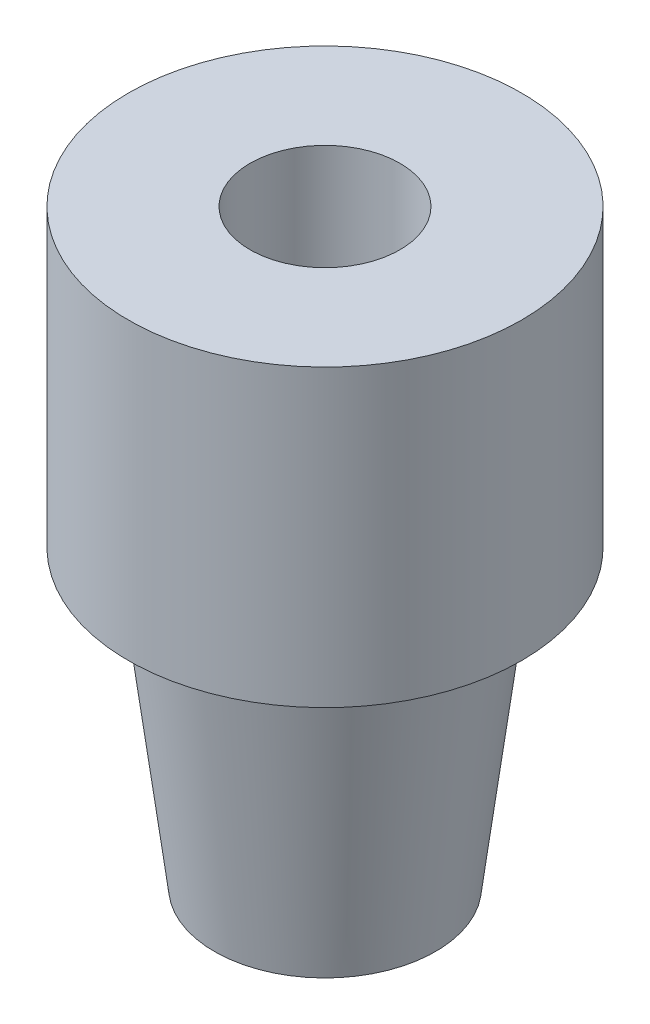
ISO-10303-21;
HEADER;
FILE_DESCRIPTION(('STEP AP214'),'2;1');
FILE_NAME('part.step','',(''),(''),'','','');
FILE_SCHEMA(('AUTOMOTIVE_DESIGN { 1 0 10303 214 1 1 1 1 }'));
ENDSEC;
DATA;
#1=APPLICATION_CONTEXT('core data for automotive mechanical design processes');
#2=APPLICATION_PROTOCOL_DEFINITION('international standard','automotive_design',2000,#1);
#3=PRODUCT_CONTEXT('',#1,'mechanical');
#4=PRODUCT('Part','Part','',(#3));
#5=PRODUCT_RELATED_PRODUCT_CATEGORY('part','',(#4));
#6=PRODUCT_DEFINITION_FORMATION('','',#4);
#7=PRODUCT_DEFINITION_CONTEXT('part definition',#1,'design');
#8=PRODUCT_DEFINITION('design','',#6,#7);
#9=PRODUCT_DEFINITION_SHAPE('','',#8);
#10=(LENGTH_UNIT() NAMED_UNIT(*) SI_UNIT(.MILLI.,.METRE.));
#11=(NAMED_UNIT(*) PLANE_ANGLE_UNIT() SI_UNIT($,.RADIAN.));
#12=(NAMED_UNIT(*) SI_UNIT($,.STERADIAN.) SOLID_ANGLE_UNIT());
#13=UNCERTAINTY_MEASURE_WITH_UNIT(LENGTH_MEASURE(1.E-05),#10,'distance_accuracy_value','');
#14=(GEOMETRIC_REPRESENTATION_CONTEXT(3) GLOBAL_UNCERTAINTY_ASSIGNED_CONTEXT((#13)) GLOBAL_UNIT_ASSIGNED_CONTEXT((#10,
#11,#12)) REPRESENTATION_CONTEXT('',''));
#15=CARTESIAN_POINT('',(0.,0.,0.));
#16=DIRECTION('',(0.,0.,1.));
#17=DIRECTION('',(1.,0.,0.));
#18=AXIS2_PLACEMENT_3D('',#15,#16,#17);
#19=CARTESIAN_POINT('',(0.,8.26607361788272,0.));
#20=DIRECTION('',(0.,-1.,0.));
#21=DIRECTION('',(1.,0.,0.));
#22=AXIS2_PLACEMENT_3D('',#19,#20,#21);
#23=PLANE('',#22);
#24=CARTESIAN_POINT('',(0.,8.26607361788272,0.));
#25=DIRECTION('',(0.,1.,0.));
#26=DIRECTION('',(-1.,0.,0.));
#27=AXIS2_PLACEMENT_3D('',#24,#25,#26);
#28=CIRCLE('',#27,3.05);
#29=CARTESIAN_POINT('',(-3.05,8.26607361788272,0.));
#30=VERTEX_POINT('',#29);
#31=EDGE_CURVE('E54',#30,#30,#28,.T.);
#32=ORIENTED_EDGE('',*,*,#31,.F.);
#33=EDGE_LOOP('',(#32));
#34=FACE_BOUND('',#33,.T.);
#35=CARTESIAN_POINT('',(0.,8.26607361788272,0.));
#36=DIRECTION('',(0.,1.,0.));
#37=DIRECTION('',(-1.,0.,0.));
#38=AXIS2_PLACEMENT_3D('',#35,#36,#37);
#39=CIRCLE('',#38,8.);
#40=CARTESIAN_POINT('',(-8.,8.26607361788272,0.));
#41=VERTEX_POINT('',#40);
#42=EDGE_CURVE('E10',#41,#41,#39,.T.);
#43=ORIENTED_EDGE('',*,*,#42,.T.);
#44=EDGE_LOOP('',(#43));
#45=FACE_BOUND('',#44,.T.);
#46=ADVANCED_FACE('F34',(#34,#45),#23,.F.);
#47=CARTESIAN_POINT('',(0.,12.5015824138226,0.));
#48=DIRECTION('',(0.,1.,0.));
#49=DIRECTION('',(-1.,0.,0.));
#50=AXIS2_PLACEMENT_3D('',#47,#48,#49);
#51=CYLINDRICAL_SURFACE('',#50,8.);
#52=ORIENTED_EDGE('',*,*,#42,.F.);
#53=EDGE_LOOP('',(#52));
#54=FACE_BOUND('',#53,.T.);
#55=CARTESIAN_POINT('',(0.,-3.73392638211728,0.));
#56=DIRECTION('',(0.,1.,0.));
#57=DIRECTION('',(-1.,0.,0.));
#58=AXIS2_PLACEMENT_3D('',#55,#56,#57);
#59=CIRCLE('',#58,8.);
#60=CARTESIAN_POINT('',(-8.,-3.73392638211728,0.));
#61=VERTEX_POINT('',#60);
#62=EDGE_CURVE('E40',#61,#61,#59,.T.);
#63=ORIENTED_EDGE('',*,*,#62,.T.);
#64=EDGE_LOOP('',(#63));
#65=FACE_BOUND('',#64,.T.);
#66=ADVANCED_FACE('F70',(#54,#65),#51,.T.);
#67=CARTESIAN_POINT('',(8.,-3.73392638211728,0.));
#68=DIRECTION('',(0.,1.,0.));
#69=DIRECTION('',(-1.,0.,0.));
#70=AXIS2_PLACEMENT_3D('',#67,#68,#69);
#71=PLANE('',#70);
#72=ORIENTED_EDGE('',*,*,#62,.F.);
#73=EDGE_LOOP('',(#72));
#74=FACE_BOUND('',#73,.T.);
#75=CARTESIAN_POINT('',(0.,-3.73392638211728,0.));
#76=DIRECTION('',(0.,1.,0.));
#77=DIRECTION('',(-1.,0.,0.));
#78=AXIS2_PLACEMENT_3D('',#75,#76,#77);
#79=CIRCLE('',#78,6.);
#80=CARTESIAN_POINT('',(-6.,-3.73392638211728,0.));
#81=VERTEX_POINT('',#80);
#82=EDGE_CURVE('E44',#81,#81,#79,.T.);
#83=ORIENTED_EDGE('',*,*,#82,.T.);
#84=EDGE_LOOP('',(#83));
#85=FACE_BOUND('',#84,.T.);
#86=ADVANCED_FACE('F74',(#74,#85),#71,.F.);
#87=CARTESIAN_POINT('',(0.,-15.7339263821173,0.));
#88=DIRECTION('',(0.,1.,0.));
#89=DIRECTION('',(-1.,0.,0.));
#90=AXIS2_PLACEMENT_3D('',#87,#88,#89);
#91=CONICAL_SURFACE('',#90,4.5,0.124354994546761);
#92=ORIENTED_EDGE('',*,*,#82,.F.);
#93=EDGE_LOOP('',(#92));
#94=FACE_BOUND('',#93,.T.);
#95=CARTESIAN_POINT('',(0.,-15.7339263821173,0.));
#96=DIRECTION('',(0.,1.,0.));
#97=DIRECTION('',(-1.,0.,0.));
#98=AXIS2_PLACEMENT_3D('',#95,#96,#97);
#99=CIRCLE('',#98,4.5);
#100=CARTESIAN_POINT('',(-4.5,-15.7339263821173,0.));
#101=VERTEX_POINT('',#100);
#102=EDGE_CURVE('E48',#101,#101,#99,.T.);
#103=ORIENTED_EDGE('',*,*,#102,.T.);
#104=EDGE_LOOP('',(#103));
#105=FACE_BOUND('',#104,.T.);
#106=ADVANCED_FACE('F79',(#94,#105),#91,.T.);
#107=CARTESIAN_POINT('',(4.5,-15.7339263821173,0.));
#108=DIRECTION('',(0.,1.,0.));
#109=DIRECTION('',(-1.,0.,0.));
#110=AXIS2_PLACEMENT_3D('',#107,#108,#109);
#111=PLANE('',#110);
#112=ORIENTED_EDGE('',*,*,#102,.F.);
#113=EDGE_LOOP('',(#112));
#114=FACE_BOUND('',#113,.T.);
#115=ADVANCED_FACE('F65',(#114),#111,.F.);
#116=CARTESIAN_POINT('',(0.,-1.73392638211728,0.));
#117=DIRECTION('',(0.,1.,0.));
#118=DIRECTION('',(-1.,0.,0.));
#119=AXIS2_PLACEMENT_3D('',#116,#117,#118);
#120=CYLINDRICAL_SURFACE('',#119,3.05);
#121=CARTESIAN_POINT('',(0.,-1.73392638211728,0.));
#122=DIRECTION('',(0.,1.,0.));
#123=DIRECTION('',(-1.,0.,0.));
#124=AXIS2_PLACEMENT_3D('',#121,#122,#123);
#125=CIRCLE('',#124,3.05);
#126=CARTESIAN_POINT('',(-3.05,-1.73392638211728,0.));
#127=VERTEX_POINT('',#126);
#128=EDGE_CURVE('E53',#127,#127,#125,.T.);
#129=ORIENTED_EDGE('',*,*,#128,.F.);
#130=EDGE_LOOP('',(#129));
#131=FACE_BOUND('',#130,.T.);
#132=ORIENTED_EDGE('',*,*,#31,.T.);
#133=EDGE_LOOP('',(#132));
#134=FACE_BOUND('',#133,.T.);
#135=ADVANCED_FACE('F62',(#131,#134),#120,.F.);
#136=CARTESIAN_POINT('',(0.,-1.73392638211728,0.));
#137=DIRECTION('',(0.,1.,0.));
#138=DIRECTION('',(-1.,0.,0.));
#139=AXIS2_PLACEMENT_3D('',#136,#137,#138);
#140=PLANE('',#139);
#141=ORIENTED_EDGE('',*,*,#128,.T.);
#142=EDGE_LOOP('',(#141));
#143=FACE_BOUND('',#142,.T.);
#144=ADVANCED_FACE('F60',(#143),#140,.T.);
#145=CLOSED_SHELL('',(#46,#66,#86,#106,#115,#135,#144));
#146=MANIFOLD_SOLID_BREP('B2',#145);
#147=ADVANCED_BREP_SHAPE_REPRESENTATION('',(#18,#146),#14);
#148=SHAPE_DEFINITION_REPRESENTATION(#9,#147);
ENDSEC;
END-ISO-10303-21;
